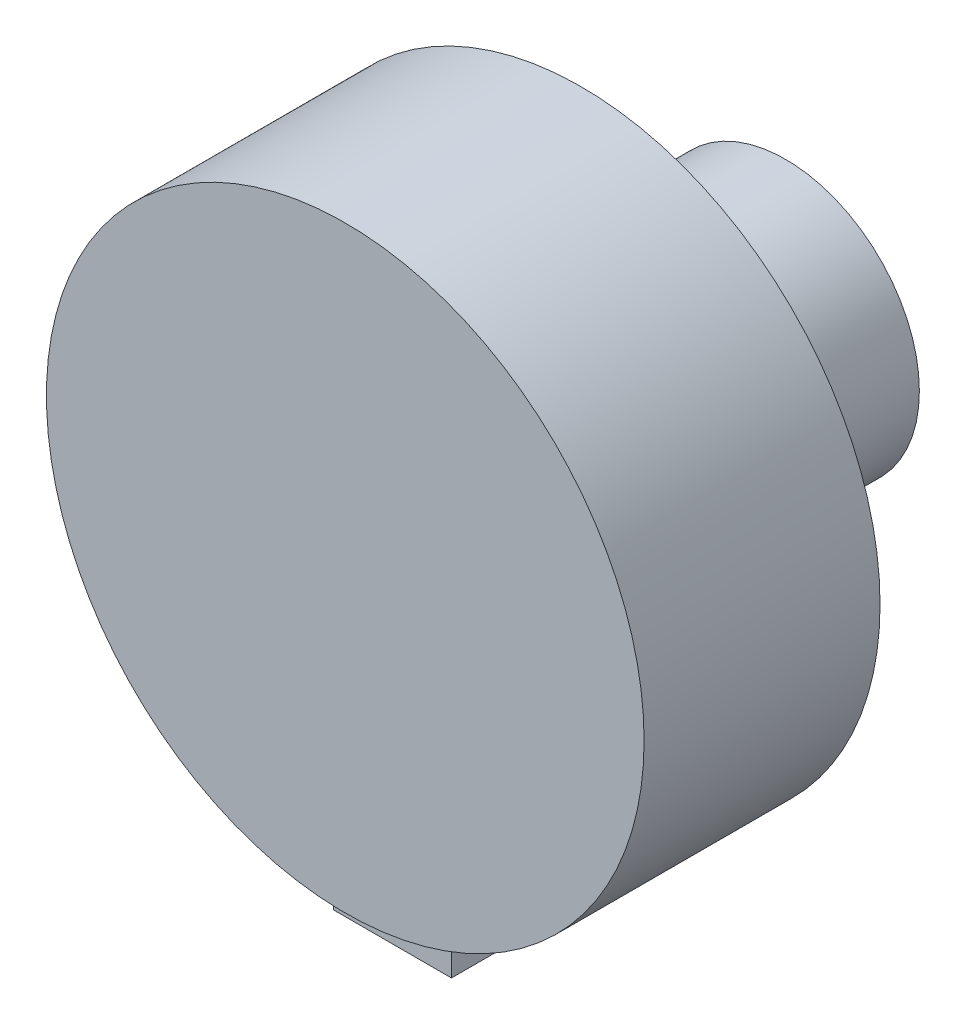
ISO-10303-21;
HEADER;
FILE_DESCRIPTION(('STEP AP214'),'2;1');
FILE_NAME('part.step','',(''),(''),'','','');
FILE_SCHEMA(('AUTOMOTIVE_DESIGN { 1 0 10303 214 1 1 1 1 }'));
ENDSEC;
DATA;
#1=APPLICATION_CONTEXT('core data for automotive mechanical design processes');
#2=APPLICATION_PROTOCOL_DEFINITION('international standard','automotive_design',2000,#1);
#3=PRODUCT_CONTEXT('',#1,'mechanical');
#4=PRODUCT('Part','Part','',(#3));
#5=PRODUCT_RELATED_PRODUCT_CATEGORY('part','',(#4));
#6=PRODUCT_DEFINITION_FORMATION('','',#4);
#7=PRODUCT_DEFINITION_CONTEXT('part definition',#1,'design');
#8=PRODUCT_DEFINITION('design','',#6,#7);
#9=PRODUCT_DEFINITION_SHAPE('','',#8);
#10=(LENGTH_UNIT() NAMED_UNIT(*) SI_UNIT(.MILLI.,.METRE.));
#11=(NAMED_UNIT(*) PLANE_ANGLE_UNIT() SI_UNIT($,.RADIAN.));
#12=(NAMED_UNIT(*) SI_UNIT($,.STERADIAN.) SOLID_ANGLE_UNIT());
#13=UNCERTAINTY_MEASURE_WITH_UNIT(LENGTH_MEASURE(1.E-05),#10,'distance_accuracy_value','');
#14=(GEOMETRIC_REPRESENTATION_CONTEXT(3) GLOBAL_UNCERTAINTY_ASSIGNED_CONTEXT((#13)) GLOBAL_UNIT_ASSIGNED_CONTEXT((#10,
#11,#12)) REPRESENTATION_CONTEXT('',''));
#15=CARTESIAN_POINT('',(0.,0.,0.));
#16=DIRECTION('',(0.,0.,1.));
#17=DIRECTION('',(1.,0.,0.));
#18=AXIS2_PLACEMENT_3D('',#15,#16,#17);
#19=CARTESIAN_POINT('',(0.,0.,38.1));
#20=DIRECTION('',(0.,0.,-1.));
#21=DIRECTION('',(-1.,0.,0.));
#22=AXIS2_PLACEMENT_3D('',#19,#20,#21);
#23=CYLINDRICAL_SURFACE('',#22,48.26);
#24=CARTESIAN_POINT('',(0.,0.,30.48));
#25=DIRECTION('',(0.,0.,1.));
#26=DIRECTION('',(1.,0.,0.));
#27=AXIS2_PLACEMENT_3D('',#24,#25,#26);
#28=CIRCLE('',#27,48.26);
#29=CARTESIAN_POINT('',(-9.525,-47.3106962007536,30.48));
#30=VERTEX_POINT('',#29);
#31=CARTESIAN_POINT('',(9.525,-47.3106962007536,30.48));
#32=VERTEX_POINT('',#31);
#33=EDGE_CURVE('E40',#30,#32,#28,.T.);
#34=ORIENTED_EDGE('',*,*,#33,.T.);
#35=DIRECTION('',(0.,0.,-1.));
#36=VECTOR('',#35,1.);
#37=CARTESIAN_POINT('',(9.525,-47.3106962007536,38.1));
#38=LINE('',#37,#36);
#39=CARTESIAN_POINT('',(9.525,-47.3106962007536,7.62000000000001));
#40=VERTEX_POINT('',#39);
#41=EDGE_CURVE('E11',#32,#40,#38,.T.);
#42=ORIENTED_EDGE('',*,*,#41,.T.);
#43=CARTESIAN_POINT('',(0.,0.,7.62000000000001));
#44=DIRECTION('',(0.,0.,-1.));
#45=DIRECTION('',(-1.,0.,0.));
#46=AXIS2_PLACEMENT_3D('',#43,#44,#45);
#47=CIRCLE('',#46,48.26);
#48=CARTESIAN_POINT('',(-9.525,-47.3106962007536,7.62000000000001));
#49=VERTEX_POINT('',#48);
#50=EDGE_CURVE('E74',#40,#49,#47,.T.);
#51=ORIENTED_EDGE('',*,*,#50,.T.);
#52=DIRECTION('',(0.,0.,-1.));
#53=VECTOR('',#52,1.);
#54=CARTESIAN_POINT('',(-9.525,-47.3106962007536,38.1));
#55=LINE('',#54,#53);
#56=EDGE_CURVE('E112',#49,#30,#55,.F.);
#57=ORIENTED_EDGE('',*,*,#56,.T.);
#58=EDGE_LOOP('',(#34,#42,#51,#57));
#59=FACE_BOUND('',#58,.T.);
#60=CARTESIAN_POINT('',(0.,0.,38.1));
#61=DIRECTION('',(0.,0.,1.));
#62=DIRECTION('',(1.,0.,0.));
#63=AXIS2_PLACEMENT_3D('',#60,#61,#62);
#64=CIRCLE('',#63,48.26);
#65=CARTESIAN_POINT('',(48.26,0.,38.1));
#66=VERTEX_POINT('',#65);
#67=EDGE_CURVE('E106',#66,#66,#64,.T.);
#68=ORIENTED_EDGE('',*,*,#67,.F.);
#69=EDGE_LOOP('',(#68));
#70=FACE_BOUND('',#69,.T.);
#71=CARTESIAN_POINT('',(0.,0.,0.));
#72=DIRECTION('',(0.,0.,1.));
#73=DIRECTION('',(1.,0.,0.));
#74=AXIS2_PLACEMENT_3D('',#71,#72,#73);
#75=CIRCLE('',#74,48.26);
#76=CARTESIAN_POINT('',(48.26,0.,0.));
#77=VERTEX_POINT('',#76);
#78=EDGE_CURVE('E102',#77,#77,#75,.T.);
#79=ORIENTED_EDGE('',*,*,#78,.T.);
#80=EDGE_LOOP('',(#79));
#81=FACE_BOUND('',#80,.T.);
#82=ADVANCED_FACE('F33',(#59,#70,#81),#23,.T.);
#83=CARTESIAN_POINT('',(0.,0.,38.1));
#84=DIRECTION('',(0.,0.,1.));
#85=DIRECTION('',(1.,0.,0.));
#86=AXIS2_PLACEMENT_3D('',#83,#84,#85);
#87=PLANE('',#86);
#88=ORIENTED_EDGE('',*,*,#67,.T.);
#89=EDGE_LOOP('',(#88));
#90=FACE_BOUND('',#89,.T.);
#91=ADVANCED_FACE('F132',(#90),#87,.T.);
#92=CARTESIAN_POINT('',(0.,0.,0.));
#93=DIRECTION('',(0.,0.,1.));
#94=DIRECTION('',(1.,0.,0.));
#95=AXIS2_PLACEMENT_3D('',#92,#93,#94);
#96=PLANE('',#95);
#97=CARTESIAN_POINT('',(0.,0.,0.));
#98=DIRECTION('',(0.,0.,-1.));
#99=DIRECTION('',(-1.,0.,0.));
#100=AXIS2_PLACEMENT_3D('',#97,#98,#99);
#101=CIRCLE('',#100,21.59);
#102=CARTESIAN_POINT('',(-21.59,0.,0.));
#103=VERTEX_POINT('',#102);
#104=EDGE_CURVE('E103',#103,#103,#101,.T.);
#105=ORIENTED_EDGE('',*,*,#104,.F.);
#106=EDGE_LOOP('',(#105));
#107=FACE_BOUND('',#106,.T.);
#108=ORIENTED_EDGE('',*,*,#78,.F.);
#109=EDGE_LOOP('',(#108));
#110=FACE_BOUND('',#109,.T.);
#111=ADVANCED_FACE('F136',(#107,#110),#96,.F.);
#112=CARTESIAN_POINT('',(0.,0.,-33.02));
#113=DIRECTION('',(0.,0.,1.));
#114=DIRECTION('',(1.,0.,0.));
#115=AXIS2_PLACEMENT_3D('',#112,#113,#114);
#116=CYLINDRICAL_SURFACE('',#115,21.59);
#117=CARTESIAN_POINT('',(0.,0.,-33.02));
#118=DIRECTION('',(0.,0.,-1.));
#119=DIRECTION('',(-1.,0.,0.));
#120=AXIS2_PLACEMENT_3D('',#117,#118,#119);
#121=CIRCLE('',#120,21.59);
#122=CARTESIAN_POINT('',(-21.59,0.,-33.02));
#123=VERTEX_POINT('',#122);
#124=EDGE_CURVE('E95',#123,#123,#121,.T.);
#125=ORIENTED_EDGE('',*,*,#124,.F.);
#126=EDGE_LOOP('',(#125));
#127=FACE_BOUND('',#126,.T.);
#128=ORIENTED_EDGE('',*,*,#104,.T.);
#129=EDGE_LOOP('',(#128));
#130=FACE_BOUND('',#129,.T.);
#131=ADVANCED_FACE('F142',(#127,#130),#116,.T.);
#132=CARTESIAN_POINT('',(0.,0.,-33.02));
#133=DIRECTION('',(0.,0.,-1.));
#134=DIRECTION('',(-1.,0.,0.));
#135=AXIS2_PLACEMENT_3D('',#132,#133,#134);
#136=PLANE('',#135);
#137=ORIENTED_EDGE('',*,*,#124,.T.);
#138=EDGE_LOOP('',(#137));
#139=FACE_BOUND('',#138,.T.);
#140=ADVANCED_FACE('F128',(#139),#136,.T.);
#141=CARTESIAN_POINT('',(9.525,-56.388,30.48));
#142=DIRECTION('',(1.,0.,0.));
#143=DIRECTION('',(0.,0.,-1.));
#144=AXIS2_PLACEMENT_3D('',#141,#142,#143);
#145=PLANE('',#144);
#146=ORIENTED_EDGE('',*,*,#41,.F.);
#147=DIRECTION('',(0.,1.,0.));
#148=VECTOR('',#147,1.);
#149=CARTESIAN_POINT('',(9.525,-56.388,30.48));
#150=LINE('',#149,#148);
#151=CARTESIAN_POINT('',(9.525,-56.388,30.48));
#152=VERTEX_POINT('',#151);
#153=EDGE_CURVE('E89',#152,#32,#150,.T.);
#154=ORIENTED_EDGE('',*,*,#153,.F.);
#155=DIRECTION('',(0.,0.,-1.));
#156=VECTOR('',#155,1.);
#157=CARTESIAN_POINT('',(9.525,-56.388,30.48));
#158=LINE('',#157,#156);
#159=CARTESIAN_POINT('',(9.525,-56.388,7.62000000000001));
#160=VERTEX_POINT('',#159);
#161=EDGE_CURVE('E83',#152,#160,#158,.T.);
#162=ORIENTED_EDGE('',*,*,#161,.T.);
#163=DIRECTION('',(0.,1.,0.));
#164=VECTOR('',#163,1.);
#165=CARTESIAN_POINT('',(9.525,-56.388,7.62000000000001));
#166=LINE('',#165,#164);
#167=EDGE_CURVE('E69',#160,#40,#166,.T.);
#168=ORIENTED_EDGE('',*,*,#167,.T.);
#169=EDGE_LOOP('',(#146,#154,#162,#168));
#170=FACE_BOUND('',#169,.T.);
#171=ADVANCED_FACE('F88',(#170),#145,.T.);
#172=CARTESIAN_POINT('',(-9.525,-56.388,30.48));
#173=DIRECTION('',(-1.,0.,0.));
#174=DIRECTION('',(0.,0.,1.));
#175=AXIS2_PLACEMENT_3D('',#172,#173,#174);
#176=PLANE('',#175);
#177=ORIENTED_EDGE('',*,*,#56,.F.);
#178=DIRECTION('',(0.,1.,0.));
#179=VECTOR('',#178,1.);
#180=CARTESIAN_POINT('',(-9.525,-56.388,7.62000000000001));
#181=LINE('',#180,#179);
#182=CARTESIAN_POINT('',(-9.525,-56.388,7.62000000000001));
#183=VERTEX_POINT('',#182);
#184=EDGE_CURVE('E47',#183,#49,#181,.T.);
#185=ORIENTED_EDGE('',*,*,#184,.F.);
#186=DIRECTION('',(0.,0.,1.));
#187=VECTOR('',#186,1.);
#188=CARTESIAN_POINT('',(-9.525,-56.388,30.48));
#189=LINE('',#188,#187);
#190=CARTESIAN_POINT('',(-9.525,-56.388,30.48));
#191=VERTEX_POINT('',#190);
#192=EDGE_CURVE('E86',#183,#191,#189,.T.);
#193=ORIENTED_EDGE('',*,*,#192,.T.);
#194=DIRECTION('',(0.,1.,0.));
#195=VECTOR('',#194,1.);
#196=CARTESIAN_POINT('',(-9.525,-56.388,30.48));
#197=LINE('',#196,#195);
#198=EDGE_CURVE('E96',#191,#30,#197,.T.);
#199=ORIENTED_EDGE('',*,*,#198,.T.);
#200=EDGE_LOOP('',(#177,#185,#193,#199));
#201=FACE_BOUND('',#200,.T.);
#202=ADVANCED_FACE('F120',(#201),#176,.T.);
#203=CARTESIAN_POINT('',(-9.525,-56.388,30.48));
#204=DIRECTION('',(0.,0.,1.));
#205=DIRECTION('',(1.,0.,0.));
#206=AXIS2_PLACEMENT_3D('',#203,#204,#205);
#207=PLANE('',#206);
#208=ORIENTED_EDGE('',*,*,#33,.F.);
#209=ORIENTED_EDGE('',*,*,#198,.F.);
#210=DIRECTION('',(1.,0.,0.));
#211=VECTOR('',#210,1.);
#212=CARTESIAN_POINT('',(-9.525,-56.388,30.48));
#213=LINE('',#212,#211);
#214=EDGE_CURVE('E76',#191,#152,#213,.T.);
#215=ORIENTED_EDGE('',*,*,#214,.T.);
#216=ORIENTED_EDGE('',*,*,#153,.T.);
#217=EDGE_LOOP('',(#208,#209,#215,#216));
#218=FACE_BOUND('',#217,.T.);
#219=ADVANCED_FACE('F118',(#218),#207,.T.);
#220=CARTESIAN_POINT('',(-9.525,-56.388,7.62000000000001));
#221=DIRECTION('',(0.,0.,-1.));
#222=DIRECTION('',(-1.,0.,0.));
#223=AXIS2_PLACEMENT_3D('',#220,#221,#222);
#224=PLANE('',#223);
#225=ORIENTED_EDGE('',*,*,#50,.F.);
#226=ORIENTED_EDGE('',*,*,#167,.F.);
#227=DIRECTION('',(-1.,0.,0.));
#228=VECTOR('',#227,1.);
#229=CARTESIAN_POINT('',(-9.525,-56.388,7.62000000000001));
#230=LINE('',#229,#228);
#231=EDGE_CURVE('E72',#160,#183,#230,.T.);
#232=ORIENTED_EDGE('',*,*,#231,.T.);
#233=ORIENTED_EDGE('',*,*,#184,.T.);
#234=EDGE_LOOP('',(#225,#226,#232,#233));
#235=FACE_BOUND('',#234,.T.);
#236=ADVANCED_FACE('F71',(#235),#224,.T.);
#237=CARTESIAN_POINT('',(0.,-56.388,0.));
#238=DIRECTION('',(0.,-1.,0.));
#239=DIRECTION('',(0.,0.,-1.));
#240=AXIS2_PLACEMENT_3D('',#237,#238,#239);
#241=PLANE('',#240);
#242=ORIENTED_EDGE('',*,*,#161,.F.);
#243=ORIENTED_EDGE('',*,*,#214,.F.);
#244=ORIENTED_EDGE('',*,*,#192,.F.);
#245=ORIENTED_EDGE('',*,*,#231,.F.);
#246=EDGE_LOOP('',(#242,#243,#244,#245));
#247=FACE_BOUND('',#246,.T.);
#248=ADVANCED_FACE('F81',(#247),#241,.T.);
#249=CLOSED_SHELL('',(#82,#91,#111,#131,#140,#171,#202,#219,#236,#248));
#250=MANIFOLD_SOLID_BREP('B2',#249);
#251=ADVANCED_BREP_SHAPE_REPRESENTATION('',(#18,#250),#14);
#252=SHAPE_DEFINITION_REPRESENTATION(#9,#251);
ENDSEC;
END-ISO-10303-21;
